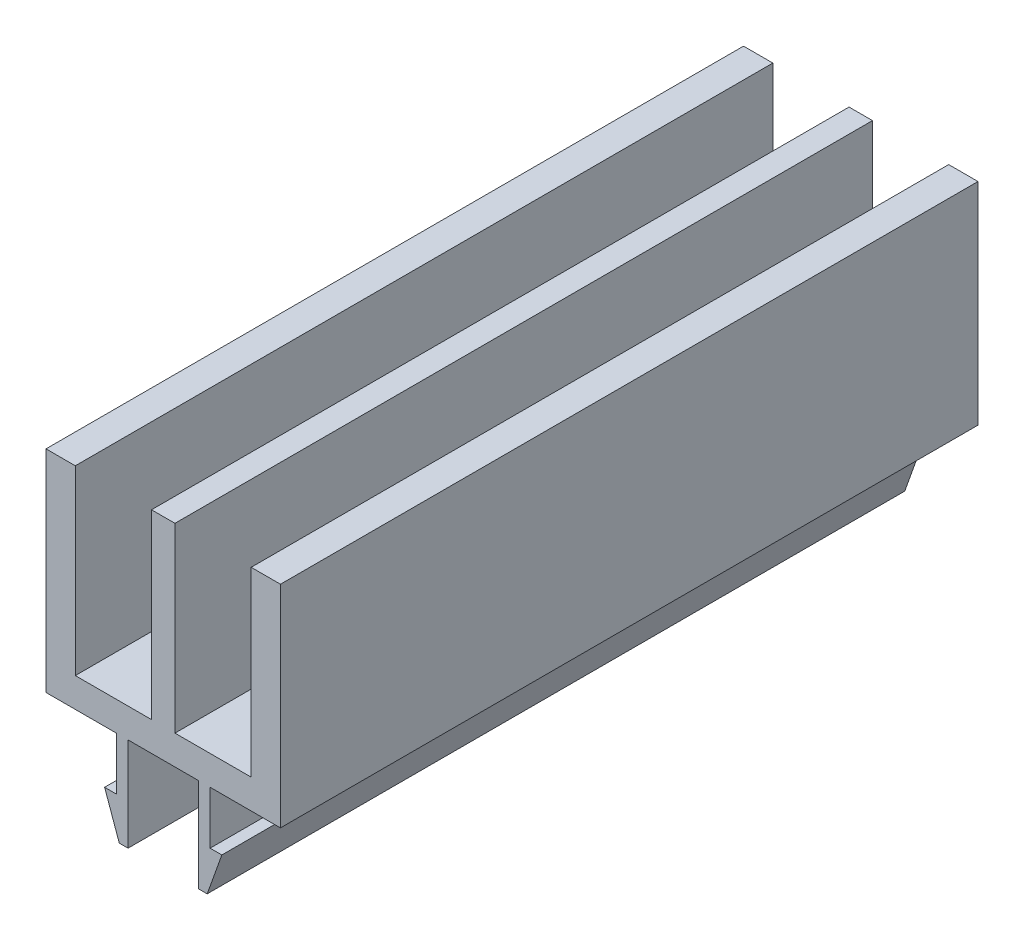
ISO-10303-21;
HEADER;
FILE_DESCRIPTION(('STEP AP214'),'2;1');
FILE_NAME('part.step','',(''),(''),'','','');
FILE_SCHEMA(('AUTOMOTIVE_DESIGN { 1 0 10303 214 1 1 1 1 }'));
ENDSEC;
DATA;
#1=APPLICATION_CONTEXT('core data for automotive mechanical design processes');
#2=APPLICATION_PROTOCOL_DEFINITION('international standard','automotive_design',2000,#1);
#3=PRODUCT_CONTEXT('',#1,'mechanical');
#4=PRODUCT('Part','Part','',(#3));
#5=PRODUCT_RELATED_PRODUCT_CATEGORY('part','',(#4));
#6=PRODUCT_DEFINITION_FORMATION('','',#4);
#7=PRODUCT_DEFINITION_CONTEXT('part definition',#1,'design');
#8=PRODUCT_DEFINITION('design','',#6,#7);
#9=PRODUCT_DEFINITION_SHAPE('','',#8);
#10=(LENGTH_UNIT() NAMED_UNIT(*) SI_UNIT(.MILLI.,.METRE.));
#11=(NAMED_UNIT(*) PLANE_ANGLE_UNIT() SI_UNIT($,.RADIAN.));
#12=(NAMED_UNIT(*) SI_UNIT($,.STERADIAN.) SOLID_ANGLE_UNIT());
#13=UNCERTAINTY_MEASURE_WITH_UNIT(LENGTH_MEASURE(1.E-05),#10,'distance_accuracy_value','');
#14=(GEOMETRIC_REPRESENTATION_CONTEXT(3) GLOBAL_UNCERTAINTY_ASSIGNED_CONTEXT((#13)) GLOBAL_UNIT_ASSIGNED_CONTEXT((#10,
#11,#12)) REPRESENTATION_CONTEXT('',''));
#15=CARTESIAN_POINT('',(0.,0.,0.));
#16=DIRECTION('',(0.,0.,1.));
#17=DIRECTION('',(1.,0.,0.));
#18=AXIS2_PLACEMENT_3D('',#15,#16,#17);
#19=CARTESIAN_POINT('',(-1.,17.9999999975,-9.49999999999999));
#20=DIRECTION('',(-1.,0.,0.));
#21=DIRECTION('',(0.,-1.,0.));
#22=AXIS2_PLACEMENT_3D('',#19,#20,#21);
#23=PLANE('',#22);
#24=DIRECTION('',(0.,-1.,0.));
#25=VECTOR('',#24,1.);
#26=CARTESIAN_POINT('',(-1.,17.9999999975,50.));
#27=LINE('',#26,#25);
#28=CARTESIAN_POINT('',(-1.,17.9999999975,50.));
#29=VERTEX_POINT('',#28);
#30=CARTESIAN_POINT('',(-1.,2.4999999995,50.));
#31=VERTEX_POINT('',#30);
#32=EDGE_CURVE('E226',#29,#31,#27,.T.);
#33=ORIENTED_EDGE('',*,*,#32,.F.);
#34=DIRECTION('',(0.,0.,1.));
#35=VECTOR('',#34,1.);
#36=CARTESIAN_POINT('',(-1.,17.9999999975,-9.49999999999999));
#37=LINE('',#36,#35);
#38=CARTESIAN_POINT('',(-1.,17.9999999975,-9.49999999999999));
#39=VERTEX_POINT('',#38);
#40=EDGE_CURVE('E11',#39,#29,#37,.T.);
#41=ORIENTED_EDGE('',*,*,#40,.F.);
#42=DIRECTION('',(0.,-1.,0.));
#43=VECTOR('',#42,1.);
#44=CARTESIAN_POINT('',(-1.,17.9999999975,-9.49999999999999));
#45=LINE('',#44,#43);
#46=CARTESIAN_POINT('',(-1.,2.4999999995,-9.49999999999999));
#47=VERTEX_POINT('',#46);
#48=EDGE_CURVE('E294',#39,#47,#45,.T.);
#49=ORIENTED_EDGE('',*,*,#48,.T.);
#50=DIRECTION('',(0.,0.,1.));
#51=VECTOR('',#50,1.);
#52=CARTESIAN_POINT('',(-1.,2.4999999995,-9.49999999999999));
#53=LINE('',#52,#51);
#54=EDGE_CURVE('E36',#47,#31,#53,.T.);
#55=ORIENTED_EDGE('',*,*,#54,.T.);
#56=EDGE_LOOP('',(#33,#41,#49,#55));
#57=FACE_BOUND('',#56,.T.);
#58=ADVANCED_FACE('F33',(#57),#23,.T.);
#59=CARTESIAN_POINT('',(0.999999999999998,17.9999999975,-9.49999999999999));
#60=DIRECTION('',(0.,1.,0.));
#61=DIRECTION('',(0.,0.,1.));
#62=AXIS2_PLACEMENT_3D('',#59,#60,#61);
#63=PLANE('',#62);
#64=DIRECTION('',(-1.,0.,0.));
#65=VECTOR('',#64,1.);
#66=CARTESIAN_POINT('',(0.999999999999998,17.9999999975,50.));
#67=LINE('',#66,#65);
#68=CARTESIAN_POINT('',(0.999999999999998,17.9999999975,50.));
#69=VERTEX_POINT('',#68);
#70=EDGE_CURVE('E292',#69,#29,#67,.T.);
#71=ORIENTED_EDGE('',*,*,#70,.F.);
#72=DIRECTION('',(0.,0.,1.));
#73=VECTOR('',#72,1.);
#74=CARTESIAN_POINT('',(0.999999999999998,17.9999999975,-9.49999999999999));
#75=LINE('',#74,#73);
#76=CARTESIAN_POINT('',(0.999999999999998,17.9999999975,-9.49999999999999));
#77=VERTEX_POINT('',#76);
#78=EDGE_CURVE('E42',#77,#69,#75,.T.);
#79=ORIENTED_EDGE('',*,*,#78,.F.);
#80=DIRECTION('',(-1.,0.,0.));
#81=VECTOR('',#80,1.);
#82=CARTESIAN_POINT('',(0.999999999999998,17.9999999975,-9.49999999999999));
#83=LINE('',#82,#81);
#84=EDGE_CURVE('E216',#77,#39,#83,.T.);
#85=ORIENTED_EDGE('',*,*,#84,.T.);
#86=ORIENTED_EDGE('',*,*,#40,.T.);
#87=EDGE_LOOP('',(#71,#79,#85,#86));
#88=FACE_BOUND('',#87,.T.);
#89=ADVANCED_FACE('F338',(#88),#63,.T.);
#90=CARTESIAN_POINT('',(0.999999999999998,2.4999999995,-9.49999999999999));
#91=DIRECTION('',(1.,0.,0.));
#92=DIRECTION('',(0.,0.,-1.));
#93=AXIS2_PLACEMENT_3D('',#90,#91,#92);
#94=PLANE('',#93);
#95=DIRECTION('',(0.,1.,0.));
#96=VECTOR('',#95,1.);
#97=CARTESIAN_POINT('',(0.999999999999998,2.4999999995,50.));
#98=LINE('',#97,#96);
#99=CARTESIAN_POINT('',(0.999999999999998,2.4999999995,50.));
#100=VERTEX_POINT('',#99);
#101=EDGE_CURVE('E203',#100,#69,#98,.T.);
#102=ORIENTED_EDGE('',*,*,#101,.F.);
#103=DIRECTION('',(0.,0.,1.));
#104=VECTOR('',#103,1.);
#105=CARTESIAN_POINT('',(0.999999999999998,2.4999999995,-9.49999999999999));
#106=LINE('',#105,#104);
#107=CARTESIAN_POINT('',(0.999999999999998,2.4999999995,-9.49999999999999));
#108=VERTEX_POINT('',#107);
#109=EDGE_CURVE('E198',#108,#100,#106,.T.);
#110=ORIENTED_EDGE('',*,*,#109,.F.);
#111=DIRECTION('',(0.,1.,0.));
#112=VECTOR('',#111,1.);
#113=CARTESIAN_POINT('',(0.999999999999998,2.4999999995,-9.49999999999999));
#114=LINE('',#113,#112);
#115=EDGE_CURVE('E201',#108,#77,#114,.T.);
#116=ORIENTED_EDGE('',*,*,#115,.T.);
#117=ORIENTED_EDGE('',*,*,#78,.T.);
#118=EDGE_LOOP('',(#102,#110,#116,#117));
#119=FACE_BOUND('',#118,.T.);
#120=ADVANCED_FACE('F200',(#119),#94,.T.);
#121=CARTESIAN_POINT('',(7.5,2.4999999995,-9.49999999999999));
#122=DIRECTION('',(0.,1.,0.));
#123=DIRECTION('',(-1.,0.,0.));
#124=AXIS2_PLACEMENT_3D('',#121,#122,#123);
#125=PLANE('',#124);
#126=DIRECTION('',(-1.,0.,0.));
#127=VECTOR('',#126,1.);
#128=CARTESIAN_POINT('',(7.5,2.4999999995,50.));
#129=LINE('',#128,#127);
#130=CARTESIAN_POINT('',(7.5,2.4999999995,50.));
#131=VERTEX_POINT('',#130);
#132=EDGE_CURVE('E289',#131,#100,#129,.T.);
#133=ORIENTED_EDGE('',*,*,#132,.F.);
#134=DIRECTION('',(0.,0.,1.));
#135=VECTOR('',#134,1.);
#136=CARTESIAN_POINT('',(7.5,2.4999999995,-9.49999999999999));
#137=LINE('',#136,#135);
#138=CARTESIAN_POINT('',(7.5,2.4999999995,-9.49999999999999));
#139=VERTEX_POINT('',#138);
#140=EDGE_CURVE('E208',#139,#131,#137,.T.);
#141=ORIENTED_EDGE('',*,*,#140,.F.);
#142=DIRECTION('',(-1.,0.,0.));
#143=VECTOR('',#142,1.);
#144=CARTESIAN_POINT('',(7.5,2.4999999995,-9.49999999999999));
#145=LINE('',#144,#143);
#146=EDGE_CURVE('E214',#139,#108,#145,.T.);
#147=ORIENTED_EDGE('',*,*,#146,.T.);
#148=ORIENTED_EDGE('',*,*,#109,.T.);
#149=EDGE_LOOP('',(#133,#141,#147,#148));
#150=FACE_BOUND('',#149,.T.);
#151=ADVANCED_FACE('F218',(#150),#125,.T.);
#152=CARTESIAN_POINT('',(7.5,17.9999999975,-9.49999999999999));
#153=DIRECTION('',(-1.,0.,0.));
#154=DIRECTION('',(0.,-1.,0.));
#155=AXIS2_PLACEMENT_3D('',#152,#153,#154);
#156=PLANE('',#155);
#157=DIRECTION('',(0.,-1.,0.));
#158=VECTOR('',#157,1.);
#159=CARTESIAN_POINT('',(7.5,17.9999999975,50.));
#160=LINE('',#159,#158);
#161=CARTESIAN_POINT('',(7.5,17.9999999975,50.));
#162=VERTEX_POINT('',#161);
#163=EDGE_CURVE('E286',#162,#131,#160,.T.);
#164=ORIENTED_EDGE('',*,*,#163,.F.);
#165=DIRECTION('',(0.,0.,1.));
#166=VECTOR('',#165,1.);
#167=CARTESIAN_POINT('',(7.5,17.9999999975,-9.49999999999999));
#168=LINE('',#167,#166);
#169=CARTESIAN_POINT('',(7.5,17.9999999975,-9.49999999999999));
#170=VERTEX_POINT('',#169);
#171=EDGE_CURVE('E298',#170,#162,#168,.T.);
#172=ORIENTED_EDGE('',*,*,#171,.F.);
#173=DIRECTION('',(0.,-1.,0.));
#174=VECTOR('',#173,1.);
#175=CARTESIAN_POINT('',(7.5,17.9999999975,-9.49999999999999));
#176=LINE('',#175,#174);
#177=EDGE_CURVE('E219',#170,#139,#176,.T.);
#178=ORIENTED_EDGE('',*,*,#177,.T.);
#179=ORIENTED_EDGE('',*,*,#140,.T.);
#180=EDGE_LOOP('',(#164,#172,#178,#179));
#181=FACE_BOUND('',#180,.T.);
#182=ADVANCED_FACE('F351',(#181),#156,.T.);
#183=CARTESIAN_POINT('',(10.,17.9999999975,-9.49999999999999));
#184=DIRECTION('',(0.,1.,0.));
#185=DIRECTION('',(0.,0.,1.));
#186=AXIS2_PLACEMENT_3D('',#183,#184,#185);
#187=PLANE('',#186);
#188=DIRECTION('',(-1.,0.,0.));
#189=VECTOR('',#188,1.);
#190=CARTESIAN_POINT('',(10.,17.9999999975,50.));
#191=LINE('',#190,#189);
#192=CARTESIAN_POINT('',(10.,17.9999999975,50.));
#193=VERTEX_POINT('',#192);
#194=EDGE_CURVE('E283',#193,#162,#191,.T.);
#195=ORIENTED_EDGE('',*,*,#194,.F.);
#196=DIRECTION('',(0.,0.,1.));
#197=VECTOR('',#196,1.);
#198=CARTESIAN_POINT('',(10.,17.9999999975,-9.49999999999999));
#199=LINE('',#198,#197);
#200=CARTESIAN_POINT('',(10.,17.9999999975,-9.49999999999999));
#201=VERTEX_POINT('',#200);
#202=EDGE_CURVE('E300',#201,#193,#199,.T.);
#203=ORIENTED_EDGE('',*,*,#202,.F.);
#204=DIRECTION('',(-1.,0.,0.));
#205=VECTOR('',#204,1.);
#206=CARTESIAN_POINT('',(10.,17.9999999975,-9.49999999999999));
#207=LINE('',#206,#205);
#208=EDGE_CURVE('E221',#201,#170,#207,.T.);
#209=ORIENTED_EDGE('',*,*,#208,.T.);
#210=ORIENTED_EDGE('',*,*,#171,.T.);
#211=EDGE_LOOP('',(#195,#203,#209,#210));
#212=FACE_BOUND('',#211,.T.);
#213=ADVANCED_FACE('F354',(#212),#187,.T.);
#214=CARTESIAN_POINT('',(10.,-4.99999828349541E-10,-9.49999999999999));
#215=DIRECTION('',(1.,0.,0.));
#216=DIRECTION('',(0.,0.,-1.));
#217=AXIS2_PLACEMENT_3D('',#214,#215,#216);
#218=PLANE('',#217);
#219=DIRECTION('',(0.,1.,0.));
#220=VECTOR('',#219,1.);
#221=CARTESIAN_POINT('',(10.,-4.99999828349541E-10,50.));
#222=LINE('',#221,#220);
#223=CARTESIAN_POINT('',(10.,-4.99999828349541E-10,50.));
#224=VERTEX_POINT('',#223);
#225=EDGE_CURVE('E280',#224,#193,#222,.T.);
#226=ORIENTED_EDGE('',*,*,#225,.F.);
#227=DIRECTION('',(0.,0.,1.));
#228=VECTOR('',#227,1.);
#229=CARTESIAN_POINT('',(10.,-4.99999828349541E-10,-9.49999999999999));
#230=LINE('',#229,#228);
#231=CARTESIAN_POINT('',(10.,-4.99999828349541E-10,-9.49999999999999));
#232=VERTEX_POINT('',#231);
#233=EDGE_CURVE('E302',#232,#224,#230,.T.);
#234=ORIENTED_EDGE('',*,*,#233,.F.);
#235=DIRECTION('',(0.,1.,0.));
#236=VECTOR('',#235,1.);
#237=CARTESIAN_POINT('',(10.,-4.99999828349541E-10,-9.49999999999999));
#238=LINE('',#237,#236);
#239=EDGE_CURVE('E644',#232,#201,#238,.T.);
#240=ORIENTED_EDGE('',*,*,#239,.T.);
#241=ORIENTED_EDGE('',*,*,#202,.T.);
#242=EDGE_LOOP('',(#226,#234,#240,#241));
#243=FACE_BOUND('',#242,.T.);
#244=ADVANCED_FACE('F358',(#243),#218,.T.);
#245=CARTESIAN_POINT('',(4.,-4.99999998002099E-10,-9.49999999999999));
#246=DIRECTION('',(0.,-1.,0.));
#247=DIRECTION('',(1.,0.,0.));
#248=AXIS2_PLACEMENT_3D('',#245,#246,#247);
#249=PLANE('',#248);
#250=DIRECTION('',(1.,0.,0.));
#251=VECTOR('',#250,1.);
#252=CARTESIAN_POINT('',(4.,-4.99999998002099E-10,50.));
#253=LINE('',#252,#251);
#254=CARTESIAN_POINT('',(4.,-4.99999998002099E-10,50.));
#255=VERTEX_POINT('',#254);
#256=EDGE_CURVE('E277',#255,#224,#253,.T.);
#257=ORIENTED_EDGE('',*,*,#256,.F.);
#258=DIRECTION('',(0.,0.,1.));
#259=VECTOR('',#258,1.);
#260=CARTESIAN_POINT('',(4.,-4.99999998002099E-10,-9.49999999999999));
#261=LINE('',#260,#259);
#262=CARTESIAN_POINT('',(4.,-4.99999998002099E-10,-9.49999999999999));
#263=VERTEX_POINT('',#262);
#264=EDGE_CURVE('E304',#263,#255,#261,.T.);
#265=ORIENTED_EDGE('',*,*,#264,.F.);
#266=DIRECTION('',(1.,0.,0.));
#267=VECTOR('',#266,1.);
#268=CARTESIAN_POINT('',(4.,-4.99999998002099E-10,-9.49999999999999));
#269=LINE('',#268,#267);
#270=EDGE_CURVE('E648',#263,#232,#269,.T.);
#271=ORIENTED_EDGE('',*,*,#270,.T.);
#272=ORIENTED_EDGE('',*,*,#233,.T.);
#273=EDGE_LOOP('',(#257,#265,#271,#272));
#274=FACE_BOUND('',#273,.T.);
#275=ADVANCED_FACE('F362',(#274),#249,.T.);
#276=CARTESIAN_POINT('',(4.,-4.5,-9.49999999999999));
#277=DIRECTION('',(1.,0.,0.));
#278=DIRECTION('',(0.,0.,-1.));
#279=AXIS2_PLACEMENT_3D('',#276,#277,#278);
#280=PLANE('',#279);
#281=DIRECTION('',(0.,1.,0.));
#282=VECTOR('',#281,1.);
#283=CARTESIAN_POINT('',(4.,-4.5,50.));
#284=LINE('',#283,#282);
#285=CARTESIAN_POINT('',(4.,-4.5,50.));
#286=VERTEX_POINT('',#285);
#287=EDGE_CURVE('E274',#286,#255,#284,.T.);
#288=ORIENTED_EDGE('',*,*,#287,.F.);
#289=DIRECTION('',(0.,0.,1.));
#290=VECTOR('',#289,1.);
#291=CARTESIAN_POINT('',(4.,-4.5,-9.49999999999999));
#292=LINE('',#291,#290);
#293=CARTESIAN_POINT('',(4.,-4.5,-9.49999999999999));
#294=VERTEX_POINT('',#293);
#295=EDGE_CURVE('E306',#294,#286,#292,.T.);
#296=ORIENTED_EDGE('',*,*,#295,.F.);
#297=DIRECTION('',(0.,1.,0.));
#298=VECTOR('',#297,1.);
#299=CARTESIAN_POINT('',(4.,-4.5,-9.49999999999999));
#300=LINE('',#299,#298);
#301=EDGE_CURVE('E637',#294,#263,#300,.T.);
#302=ORIENTED_EDGE('',*,*,#301,.T.);
#303=ORIENTED_EDGE('',*,*,#264,.T.);
#304=EDGE_LOOP('',(#288,#296,#302,#303));
#305=FACE_BOUND('',#304,.T.);
#306=ADVANCED_FACE('F366',(#305),#280,.T.);
#307=CARTESIAN_POINT('',(5.,-4.5,-9.49999999999999));
#308=DIRECTION('',(0.,1.,0.));
#309=DIRECTION('',(0.,0.,1.));
#310=AXIS2_PLACEMENT_3D('',#307,#308,#309);
#311=PLANE('',#310);
#312=DIRECTION('',(-1.,0.,0.));
#313=VECTOR('',#312,1.);
#314=CARTESIAN_POINT('',(5.,-4.5,50.));
#315=LINE('',#314,#313);
#316=CARTESIAN_POINT('',(5.,-4.5,50.));
#317=VERTEX_POINT('',#316);
#318=EDGE_CURVE('E271',#317,#286,#315,.T.);
#319=ORIENTED_EDGE('',*,*,#318,.F.);
#320=DIRECTION('',(0.,0.,1.));
#321=VECTOR('',#320,1.);
#322=CARTESIAN_POINT('',(5.,-4.5,-9.49999999999999));
#323=LINE('',#322,#321);
#324=CARTESIAN_POINT('',(5.,-4.5,-9.49999999999999));
#325=VERTEX_POINT('',#324);
#326=EDGE_CURVE('E308',#325,#317,#323,.T.);
#327=ORIENTED_EDGE('',*,*,#326,.F.);
#328=DIRECTION('',(-1.,0.,0.));
#329=VECTOR('',#328,1.);
#330=CARTESIAN_POINT('',(5.,-4.5,-9.49999999999999));
#331=LINE('',#330,#329);
#332=EDGE_CURVE('E633',#325,#294,#331,.T.);
#333=ORIENTED_EDGE('',*,*,#332,.T.);
#334=ORIENTED_EDGE('',*,*,#295,.T.);
#335=EDGE_LOOP('',(#319,#327,#333,#334));
#336=FACE_BOUND('',#335,.T.);
#337=ADVANCED_FACE('F370',(#336),#311,.T.);
#338=CARTESIAN_POINT('',(3.75,-8.,-9.49999999999999));
#339=DIRECTION('',(0.941741911594837,-0.336336396998156,0.));
#340=DIRECTION('',(0.336336396998156,0.941741911594838,0.));
#341=AXIS2_PLACEMENT_3D('',#338,#339,#340);
#342=PLANE('',#341);
#343=DIRECTION('',(0.336336396998157,0.941741911594837,0.));
#344=VECTOR('',#343,1.);
#345=CARTESIAN_POINT('',(3.75,-8.,50.));
#346=LINE('',#345,#344);
#347=CARTESIAN_POINT('',(3.75,-8.,50.));
#348=VERTEX_POINT('',#347);
#349=EDGE_CURVE('E268',#348,#317,#346,.T.);
#350=ORIENTED_EDGE('',*,*,#349,.F.);
#351=DIRECTION('',(0.,0.,1.));
#352=VECTOR('',#351,1.);
#353=CARTESIAN_POINT('',(3.75,-8.,-9.49999999999999));
#354=LINE('',#353,#352);
#355=CARTESIAN_POINT('',(3.75,-8.,-9.49999999999999));
#356=VERTEX_POINT('',#355);
#357=EDGE_CURVE('E310',#356,#348,#354,.T.);
#358=ORIENTED_EDGE('',*,*,#357,.F.);
#359=DIRECTION('',(0.336336396998157,0.941741911594837,0.));
#360=VECTOR('',#359,1.);
#361=CARTESIAN_POINT('',(3.75,-8.,-9.49999999999999));
#362=LINE('',#361,#360);
#363=EDGE_CURVE('E654',#356,#325,#362,.T.);
#364=ORIENTED_EDGE('',*,*,#363,.T.);
#365=ORIENTED_EDGE('',*,*,#326,.T.);
#366=EDGE_LOOP('',(#350,#358,#364,#365));
#367=FACE_BOUND('',#366,.T.);
#368=ADVANCED_FACE('F374',(#367),#342,.T.);
#369=CARTESIAN_POINT('',(3.,-8.,-9.49999999999999));
#370=DIRECTION('',(0.,-1.,0.));
#371=DIRECTION('',(0.,0.,-1.));
#372=AXIS2_PLACEMENT_3D('',#369,#370,#371);
#373=PLANE('',#372);
#374=DIRECTION('',(1.,0.,0.));
#375=VECTOR('',#374,1.);
#376=CARTESIAN_POINT('',(3.,-8.,50.));
#377=LINE('',#376,#375);
#378=CARTESIAN_POINT('',(3.,-8.,50.));
#379=VERTEX_POINT('',#378);
#380=EDGE_CURVE('E265',#379,#348,#377,.T.);
#381=ORIENTED_EDGE('',*,*,#380,.F.);
#382=DIRECTION('',(0.,0.,1.));
#383=VECTOR('',#382,1.);
#384=CARTESIAN_POINT('',(3.,-8.,-9.49999999999999));
#385=LINE('',#384,#383);
#386=CARTESIAN_POINT('',(3.,-8.,-9.49999999999999));
#387=VERTEX_POINT('',#386);
#388=EDGE_CURVE('E312',#387,#379,#385,.T.);
#389=ORIENTED_EDGE('',*,*,#388,.F.);
#390=DIRECTION('',(1.,0.,0.));
#391=VECTOR('',#390,1.);
#392=CARTESIAN_POINT('',(3.,-8.,-9.49999999999999));
#393=LINE('',#392,#391);
#394=EDGE_CURVE('E626',#387,#356,#393,.T.);
#395=ORIENTED_EDGE('',*,*,#394,.T.);
#396=ORIENTED_EDGE('',*,*,#357,.T.);
#397=EDGE_LOOP('',(#381,#389,#395,#396));
#398=FACE_BOUND('',#397,.T.);
#399=ADVANCED_FACE('F378',(#398),#373,.T.);
#400=CARTESIAN_POINT('',(3.,-4.9999985194348E-10,-9.49999999999999));
#401=DIRECTION('',(-1.,0.,0.));
#402=DIRECTION('',(0.,0.,1.));
#403=AXIS2_PLACEMENT_3D('',#400,#401,#402);
#404=PLANE('',#403);
#405=DIRECTION('',(0.,-1.,0.));
#406=VECTOR('',#405,1.);
#407=CARTESIAN_POINT('',(3.,-4.9999985194348E-10,50.));
#408=LINE('',#407,#406);
#409=CARTESIAN_POINT('',(3.,-4.9999985194348E-10,50.));
#410=VERTEX_POINT('',#409);
#411=EDGE_CURVE('E262',#410,#379,#408,.T.);
#412=ORIENTED_EDGE('',*,*,#411,.F.);
#413=DIRECTION('',(0.,0.,1.));
#414=VECTOR('',#413,1.);
#415=CARTESIAN_POINT('',(3.,-4.9999985194348E-10,-9.49999999999999));
#416=LINE('',#415,#414);
#417=CARTESIAN_POINT('',(3.,-4.9999985194348E-10,-9.49999999999999));
#418=VERTEX_POINT('',#417);
#419=EDGE_CURVE('E314',#418,#410,#416,.T.);
#420=ORIENTED_EDGE('',*,*,#419,.F.);
#421=DIRECTION('',(0.,-1.,0.));
#422=VECTOR('',#421,1.);
#423=CARTESIAN_POINT('',(3.,-4.9999985194348E-10,-9.49999999999999));
#424=LINE('',#423,#422);
#425=EDGE_CURVE('E622',#418,#387,#424,.T.);
#426=ORIENTED_EDGE('',*,*,#425,.T.);
#427=ORIENTED_EDGE('',*,*,#388,.T.);
#428=EDGE_LOOP('',(#412,#420,#426,#427));
#429=FACE_BOUND('',#428,.T.);
#430=ADVANCED_FACE('F382',(#429),#404,.T.);
#431=CARTESIAN_POINT('',(-3.,-4.99999455901012E-10,-9.49999999999999));
#432=DIRECTION('',(0.,-1.,0.));
#433=DIRECTION('',(1.,0.,0.));
#434=AXIS2_PLACEMENT_3D('',#431,#432,#433);
#435=PLANE('',#434);
#436=DIRECTION('',(1.,0.,0.));
#437=VECTOR('',#436,1.);
#438=CARTESIAN_POINT('',(-3.,-4.99999455901012E-10,50.));
#439=LINE('',#438,#437);
#440=CARTESIAN_POINT('',(-3.,-4.99999455901012E-10,50.));
#441=VERTEX_POINT('',#440);
#442=EDGE_CURVE('E259',#441,#410,#439,.T.);
#443=ORIENTED_EDGE('',*,*,#442,.F.);
#444=DIRECTION('',(0.,0.,1.));
#445=VECTOR('',#444,1.);
#446=CARTESIAN_POINT('',(-3.,-4.99999455901012E-10,-9.49999999999999));
#447=LINE('',#446,#445);
#448=CARTESIAN_POINT('',(-3.,-4.99999455901012E-10,-9.49999999999999));
#449=VERTEX_POINT('',#448);
#450=EDGE_CURVE('E316',#449,#441,#447,.T.);
#451=ORIENTED_EDGE('',*,*,#450,.F.);
#452=DIRECTION('',(1.,0.,0.));
#453=VECTOR('',#452,1.);
#454=CARTESIAN_POINT('',(-3.,-4.99999455901012E-10,-9.49999999999999));
#455=LINE('',#454,#453);
#456=EDGE_CURVE('E658',#449,#418,#455,.T.);
#457=ORIENTED_EDGE('',*,*,#456,.T.);
#458=ORIENTED_EDGE('',*,*,#419,.T.);
#459=EDGE_LOOP('',(#443,#451,#457,#458));
#460=FACE_BOUND('',#459,.T.);
#461=ADVANCED_FACE('F386',(#460),#435,.T.);
#462=CARTESIAN_POINT('',(-3.,-8.,-9.49999999999999));
#463=DIRECTION('',(1.,0.,0.));
#464=DIRECTION('',(0.,0.,-1.));
#465=AXIS2_PLACEMENT_3D('',#462,#463,#464);
#466=PLANE('',#465);
#467=DIRECTION('',(0.,1.,0.));
#468=VECTOR('',#467,1.);
#469=CARTESIAN_POINT('',(-3.,-8.,50.));
#470=LINE('',#469,#468);
#471=CARTESIAN_POINT('',(-3.,-8.,50.));
#472=VERTEX_POINT('',#471);
#473=EDGE_CURVE('E256',#472,#441,#470,.T.);
#474=ORIENTED_EDGE('',*,*,#473,.F.);
#475=DIRECTION('',(0.,0.,1.));
#476=VECTOR('',#475,1.);
#477=CARTESIAN_POINT('',(-3.,-8.,-9.49999999999999));
#478=LINE('',#477,#476);
#479=CARTESIAN_POINT('',(-3.,-8.,-9.49999999999999));
#480=VERTEX_POINT('',#479);
#481=EDGE_CURVE('E318',#480,#472,#478,.T.);
#482=ORIENTED_EDGE('',*,*,#481,.F.);
#483=DIRECTION('',(0.,1.,0.));
#484=VECTOR('',#483,1.);
#485=CARTESIAN_POINT('',(-3.,-8.,-9.49999999999999));
#486=LINE('',#485,#484);
#487=EDGE_CURVE('E615',#480,#449,#486,.T.);
#488=ORIENTED_EDGE('',*,*,#487,.T.);
#489=ORIENTED_EDGE('',*,*,#450,.T.);
#490=EDGE_LOOP('',(#474,#482,#488,#489));
#491=FACE_BOUND('',#490,.T.);
#492=ADVANCED_FACE('F390',(#491),#466,.T.);
#493=CARTESIAN_POINT('',(-3.75,-8.,-9.49999999999999));
#494=DIRECTION('',(0.,-1.,0.));
#495=DIRECTION('',(0.,0.,-1.));
#496=AXIS2_PLACEMENT_3D('',#493,#494,#495);
#497=PLANE('',#496);
#498=DIRECTION('',(1.,0.,0.));
#499=VECTOR('',#498,1.);
#500=CARTESIAN_POINT('',(-3.75,-8.,50.));
#501=LINE('',#500,#499);
#502=CARTESIAN_POINT('',(-3.75,-8.,50.));
#503=VERTEX_POINT('',#502);
#504=EDGE_CURVE('E253',#503,#472,#501,.T.);
#505=ORIENTED_EDGE('',*,*,#504,.F.);
#506=DIRECTION('',(0.,0.,1.));
#507=VECTOR('',#506,1.);
#508=CARTESIAN_POINT('',(-3.75,-8.,-9.49999999999999));
#509=LINE('',#508,#507);
#510=CARTESIAN_POINT('',(-3.75,-8.,-9.49999999999999));
#511=VERTEX_POINT('',#510);
#512=EDGE_CURVE('E320',#511,#503,#509,.T.);
#513=ORIENTED_EDGE('',*,*,#512,.F.);
#514=DIRECTION('',(1.,0.,0.));
#515=VECTOR('',#514,1.);
#516=CARTESIAN_POINT('',(-3.75,-8.,-9.49999999999999));
#517=LINE('',#516,#515);
#518=EDGE_CURVE('E611',#511,#480,#517,.T.);
#519=ORIENTED_EDGE('',*,*,#518,.T.);
#520=ORIENTED_EDGE('',*,*,#481,.T.);
#521=EDGE_LOOP('',(#505,#513,#519,#520));
#522=FACE_BOUND('',#521,.T.);
#523=ADVANCED_FACE('F394',(#522),#497,.T.);
#524=CARTESIAN_POINT('',(-5.,-4.5,-9.49999999999999));
#525=DIRECTION('',(-0.941741911594837,-0.336336396998156,0.));
#526=DIRECTION('',(0.336336396998156,-0.941741911594838,0.));
#527=AXIS2_PLACEMENT_3D('',#524,#525,#526);
#528=PLANE('',#527);
#529=DIRECTION('',(0.336336396998156,-0.941741911594837,0.));
#530=VECTOR('',#529,1.);
#531=CARTESIAN_POINT('',(-5.,-4.5,50.));
#532=LINE('',#531,#530);
#533=CARTESIAN_POINT('',(-5.,-4.5,50.));
#534=VERTEX_POINT('',#533);
#535=EDGE_CURVE('E250',#534,#503,#532,.T.);
#536=ORIENTED_EDGE('',*,*,#535,.F.);
#537=DIRECTION('',(0.,0.,1.));
#538=VECTOR('',#537,1.);
#539=CARTESIAN_POINT('',(-5.,-4.5,-9.49999999999999));
#540=LINE('',#539,#538);
#541=CARTESIAN_POINT('',(-5.,-4.5,-9.49999999999999));
#542=VERTEX_POINT('',#541);
#543=EDGE_CURVE('E322',#542,#534,#540,.T.);
#544=ORIENTED_EDGE('',*,*,#543,.F.);
#545=DIRECTION('',(0.336336396998156,-0.941741911594837,0.));
#546=VECTOR('',#545,1.);
#547=CARTESIAN_POINT('',(-5.,-4.5,-9.49999999999999));
#548=LINE('',#547,#546);
#549=EDGE_CURVE('E662',#542,#511,#548,.T.);
#550=ORIENTED_EDGE('',*,*,#549,.T.);
#551=ORIENTED_EDGE('',*,*,#512,.T.);
#552=EDGE_LOOP('',(#536,#544,#550,#551));
#553=FACE_BOUND('',#552,.T.);
#554=ADVANCED_FACE('F398',(#553),#528,.T.);
#555=CARTESIAN_POINT('',(-4.,-4.5,-9.49999999999999));
#556=DIRECTION('',(0.,1.,0.));
#557=DIRECTION('',(0.,0.,1.));
#558=AXIS2_PLACEMENT_3D('',#555,#556,#557);
#559=PLANE('',#558);
#560=DIRECTION('',(-1.,0.,0.));
#561=VECTOR('',#560,1.);
#562=CARTESIAN_POINT('',(-4.,-4.5,50.));
#563=LINE('',#562,#561);
#564=CARTESIAN_POINT('',(-4.,-4.5,50.));
#565=VERTEX_POINT('',#564);
#566=EDGE_CURVE('E247',#565,#534,#563,.T.);
#567=ORIENTED_EDGE('',*,*,#566,.F.);
#568=DIRECTION('',(0.,0.,1.));
#569=VECTOR('',#568,1.);
#570=CARTESIAN_POINT('',(-4.,-4.5,-9.49999999999999));
#571=LINE('',#570,#569);
#572=CARTESIAN_POINT('',(-4.,-4.5,-9.49999999999999));
#573=VERTEX_POINT('',#572);
#574=EDGE_CURVE('E324',#573,#565,#571,.T.);
#575=ORIENTED_EDGE('',*,*,#574,.F.);
#576=DIRECTION('',(-1.,0.,0.));
#577=VECTOR('',#576,1.);
#578=CARTESIAN_POINT('',(-4.,-4.5,-9.49999999999999));
#579=LINE('',#578,#577);
#580=EDGE_CURVE('E604',#573,#542,#579,.T.);
#581=ORIENTED_EDGE('',*,*,#580,.T.);
#582=ORIENTED_EDGE('',*,*,#543,.T.);
#583=EDGE_LOOP('',(#567,#575,#581,#582));
#584=FACE_BOUND('',#583,.T.);
#585=ADVANCED_FACE('F402',(#584),#559,.T.);
#586=CARTESIAN_POINT('',(-4.,-4.9999985194348E-10,-9.49999999999999));
#587=DIRECTION('',(-1.,0.,0.));
#588=DIRECTION('',(0.,0.,1.));
#589=AXIS2_PLACEMENT_3D('',#586,#587,#588);
#590=PLANE('',#589);
#591=DIRECTION('',(0.,-1.,0.));
#592=VECTOR('',#591,1.);
#593=CARTESIAN_POINT('',(-4.,-4.9999985194348E-10,50.));
#594=LINE('',#593,#592);
#595=CARTESIAN_POINT('',(-4.,-4.9999985194348E-10,50.));
#596=VERTEX_POINT('',#595);
#597=EDGE_CURVE('E244',#596,#565,#594,.T.);
#598=ORIENTED_EDGE('',*,*,#597,.F.);
#599=DIRECTION('',(0.,0.,1.));
#600=VECTOR('',#599,1.);
#601=CARTESIAN_POINT('',(-4.,-4.9999985194348E-10,-9.49999999999999));
#602=LINE('',#601,#600);
#603=CARTESIAN_POINT('',(-4.,-4.9999985194348E-10,-9.49999999999999));
#604=VERTEX_POINT('',#603);
#605=EDGE_CURVE('E326',#604,#596,#602,.T.);
#606=ORIENTED_EDGE('',*,*,#605,.F.);
#607=DIRECTION('',(0.,-1.,0.));
#608=VECTOR('',#607,1.);
#609=CARTESIAN_POINT('',(-4.,-4.9999985194348E-10,-9.49999999999999));
#610=LINE('',#609,#608);
#611=EDGE_CURVE('E600',#604,#573,#610,.T.);
#612=ORIENTED_EDGE('',*,*,#611,.T.);
#613=ORIENTED_EDGE('',*,*,#574,.T.);
#614=EDGE_LOOP('',(#598,#606,#612,#613));
#615=FACE_BOUND('',#614,.T.);
#616=ADVANCED_FACE('F406',(#615),#590,.T.);
#617=CARTESIAN_POINT('',(-10.,-4.99999719929324E-10,-9.49999999999999));
#618=DIRECTION('',(0.,-1.,0.));
#619=DIRECTION('',(1.,0.,0.));
#620=AXIS2_PLACEMENT_3D('',#617,#618,#619);
#621=PLANE('',#620);
#622=DIRECTION('',(1.,0.,0.));
#623=VECTOR('',#622,1.);
#624=CARTESIAN_POINT('',(-10.,-4.99999719929324E-10,50.));
#625=LINE('',#624,#623);
#626=CARTESIAN_POINT('',(-10.,-4.99999719929324E-10,50.));
#627=VERTEX_POINT('',#626);
#628=EDGE_CURVE('E241',#627,#596,#625,.T.);
#629=ORIENTED_EDGE('',*,*,#628,.F.);
#630=DIRECTION('',(0.,0.,1.));
#631=VECTOR('',#630,1.);
#632=CARTESIAN_POINT('',(-10.,-4.99999719929324E-10,-9.49999999999999));
#633=LINE('',#632,#631);
#634=CARTESIAN_POINT('',(-10.,-4.99999719929324E-10,-9.49999999999999));
#635=VERTEX_POINT('',#634);
#636=EDGE_CURVE('E328',#635,#627,#633,.T.);
#637=ORIENTED_EDGE('',*,*,#636,.F.);
#638=DIRECTION('',(1.,0.,0.));
#639=VECTOR('',#638,1.);
#640=CARTESIAN_POINT('',(-10.,-4.99999719929324E-10,-9.49999999999999));
#641=LINE('',#640,#639);
#642=EDGE_CURVE('E666',#635,#604,#641,.T.);
#643=ORIENTED_EDGE('',*,*,#642,.T.);
#644=ORIENTED_EDGE('',*,*,#605,.T.);
#645=EDGE_LOOP('',(#629,#637,#643,#644));
#646=FACE_BOUND('',#645,.T.);
#647=ADVANCED_FACE('F410',(#646),#621,.T.);
#648=CARTESIAN_POINT('',(-10.,17.9999999975,-9.49999999999999));
#649=DIRECTION('',(-1.,0.,0.));
#650=DIRECTION('',(0.,-1.,0.));
#651=AXIS2_PLACEMENT_3D('',#648,#649,#650);
#652=PLANE('',#651);
#653=DIRECTION('',(0.,-1.,0.));
#654=VECTOR('',#653,1.);
#655=CARTESIAN_POINT('',(-10.,17.9999999975,50.));
#656=LINE('',#655,#654);
#657=CARTESIAN_POINT('',(-10.,17.9999999975,50.));
#658=VERTEX_POINT('',#657);
#659=EDGE_CURVE('E238',#658,#627,#656,.T.);
#660=ORIENTED_EDGE('',*,*,#659,.F.);
#661=DIRECTION('',(0.,0.,1.));
#662=VECTOR('',#661,1.);
#663=CARTESIAN_POINT('',(-10.,17.9999999975,-9.49999999999999));
#664=LINE('',#663,#662);
#665=CARTESIAN_POINT('',(-10.,17.9999999975,-9.49999999999999));
#666=VERTEX_POINT('',#665);
#667=EDGE_CURVE('E330',#666,#658,#664,.T.);
#668=ORIENTED_EDGE('',*,*,#667,.F.);
#669=DIRECTION('',(0.,-1.,0.));
#670=VECTOR('',#669,1.);
#671=CARTESIAN_POINT('',(-10.,17.9999999975,-9.49999999999999));
#672=LINE('',#671,#670);
#673=EDGE_CURVE('E593',#666,#635,#672,.T.);
#674=ORIENTED_EDGE('',*,*,#673,.T.);
#675=ORIENTED_EDGE('',*,*,#636,.T.);
#676=EDGE_LOOP('',(#660,#668,#674,#675));
#677=FACE_BOUND('',#676,.T.);
#678=ADVANCED_FACE('F414',(#677),#652,.T.);
#679=CARTESIAN_POINT('',(-7.5,17.9999999975,-9.49999999999999));
#680=DIRECTION('',(0.,1.,0.));
#681=DIRECTION('',(0.,0.,1.));
#682=AXIS2_PLACEMENT_3D('',#679,#680,#681);
#683=PLANE('',#682);
#684=DIRECTION('',(-1.,0.,0.));
#685=VECTOR('',#684,1.);
#686=CARTESIAN_POINT('',(-7.5,17.9999999975,50.));
#687=LINE('',#686,#685);
#688=CARTESIAN_POINT('',(-7.5,17.9999999975,50.));
#689=VERTEX_POINT('',#688);
#690=EDGE_CURVE('E235',#689,#658,#687,.T.);
#691=ORIENTED_EDGE('',*,*,#690,.F.);
#692=DIRECTION('',(0.,0.,1.));
#693=VECTOR('',#692,1.);
#694=CARTESIAN_POINT('',(-7.5,17.9999999975,-9.49999999999999));
#695=LINE('',#694,#693);
#696=CARTESIAN_POINT('',(-7.5,17.9999999975,-9.49999999999999));
#697=VERTEX_POINT('',#696);
#698=EDGE_CURVE('E332',#697,#689,#695,.T.);
#699=ORIENTED_EDGE('',*,*,#698,.F.);
#700=DIRECTION('',(-1.,0.,0.));
#701=VECTOR('',#700,1.);
#702=CARTESIAN_POINT('',(-7.5,17.9999999975,-9.49999999999999));
#703=LINE('',#702,#701);
#704=EDGE_CURVE('E589',#697,#666,#703,.T.);
#705=ORIENTED_EDGE('',*,*,#704,.T.);
#706=ORIENTED_EDGE('',*,*,#667,.T.);
#707=EDGE_LOOP('',(#691,#699,#705,#706));
#708=FACE_BOUND('',#707,.T.);
#709=ADVANCED_FACE('F418',(#708),#683,.T.);
#710=CARTESIAN_POINT('',(-7.5,2.4999999995,-9.49999999999999));
#711=DIRECTION('',(1.,0.,0.));
#712=DIRECTION('',(0.,0.,-1.));
#713=AXIS2_PLACEMENT_3D('',#710,#711,#712);
#714=PLANE('',#713);
#715=DIRECTION('',(0.,1.,0.));
#716=VECTOR('',#715,1.);
#717=CARTESIAN_POINT('',(-7.5,2.4999999995,50.));
#718=LINE('',#717,#716);
#719=CARTESIAN_POINT('',(-7.5,2.4999999995,50.));
#720=VERTEX_POINT('',#719);
#721=EDGE_CURVE('E232',#720,#689,#718,.T.);
#722=ORIENTED_EDGE('',*,*,#721,.F.);
#723=DIRECTION('',(0.,0.,1.));
#724=VECTOR('',#723,1.);
#725=CARTESIAN_POINT('',(-7.5,2.4999999995,-9.49999999999999));
#726=LINE('',#725,#724);
#727=CARTESIAN_POINT('',(-7.5,2.4999999995,-9.49999999999999));
#728=VERTEX_POINT('',#727);
#729=EDGE_CURVE('E333',#728,#720,#726,.T.);
#730=ORIENTED_EDGE('',*,*,#729,.F.);
#731=DIRECTION('',(0.,1.,0.));
#732=VECTOR('',#731,1.);
#733=CARTESIAN_POINT('',(-7.5,2.4999999995,-9.49999999999999));
#734=LINE('',#733,#732);
#735=EDGE_CURVE('E670',#728,#697,#734,.T.);
#736=ORIENTED_EDGE('',*,*,#735,.T.);
#737=ORIENTED_EDGE('',*,*,#698,.T.);
#738=EDGE_LOOP('',(#722,#730,#736,#737));
#739=FACE_BOUND('',#738,.T.);
#740=ADVANCED_FACE('F422',(#739),#714,.T.);
#741=CARTESIAN_POINT('',(-1.,2.4999999995,-9.49999999999999));
#742=DIRECTION('',(0.,1.,0.));
#743=DIRECTION('',(-1.,0.,0.));
#744=AXIS2_PLACEMENT_3D('',#741,#742,#743);
#745=PLANE('',#744);
#746=DIRECTION('',(-1.,0.,0.));
#747=VECTOR('',#746,1.);
#748=CARTESIAN_POINT('',(-1.,2.4999999995,50.));
#749=LINE('',#748,#747);
#750=EDGE_CURVE('E229',#31,#720,#749,.T.);
#751=ORIENTED_EDGE('',*,*,#750,.F.);
#752=ORIENTED_EDGE('',*,*,#54,.F.);
#753=DIRECTION('',(-1.,0.,0.));
#754=VECTOR('',#753,1.);
#755=CARTESIAN_POINT('',(-1.,2.4999999995,-9.49999999999999));
#756=LINE('',#755,#754);
#757=EDGE_CURVE('E672',#47,#728,#756,.T.);
#758=ORIENTED_EDGE('',*,*,#757,.T.);
#759=ORIENTED_EDGE('',*,*,#729,.T.);
#760=EDGE_LOOP('',(#751,#752,#758,#759));
#761=FACE_BOUND('',#760,.T.);
#762=ADVANCED_FACE('F335',(#761),#745,.T.);
#763=CARTESIAN_POINT('',(0.,0.,-9.49999999999999));
#764=DIRECTION('',(0.,0.,-1.));
#765=DIRECTION('',(-1.,0.,0.));
#766=AXIS2_PLACEMENT_3D('',#763,#764,#765);
#767=PLANE('',#766);
#768=ORIENTED_EDGE('',*,*,#48,.F.);
#769=ORIENTED_EDGE('',*,*,#84,.F.);
#770=ORIENTED_EDGE('',*,*,#115,.F.);
#771=ORIENTED_EDGE('',*,*,#146,.F.);
#772=ORIENTED_EDGE('',*,*,#177,.F.);
#773=ORIENTED_EDGE('',*,*,#208,.F.);
#774=ORIENTED_EDGE('',*,*,#239,.F.);
#775=ORIENTED_EDGE('',*,*,#270,.F.);
#776=ORIENTED_EDGE('',*,*,#301,.F.);
#777=ORIENTED_EDGE('',*,*,#332,.F.);
#778=ORIENTED_EDGE('',*,*,#363,.F.);
#779=ORIENTED_EDGE('',*,*,#394,.F.);
#780=ORIENTED_EDGE('',*,*,#425,.F.);
#781=ORIENTED_EDGE('',*,*,#456,.F.);
#782=ORIENTED_EDGE('',*,*,#487,.F.);
#783=ORIENTED_EDGE('',*,*,#518,.F.);
#784=ORIENTED_EDGE('',*,*,#549,.F.);
#785=ORIENTED_EDGE('',*,*,#580,.F.);
#786=ORIENTED_EDGE('',*,*,#611,.F.);
#787=ORIENTED_EDGE('',*,*,#642,.F.);
#788=ORIENTED_EDGE('',*,*,#673,.F.);
#789=ORIENTED_EDGE('',*,*,#704,.F.);
#790=ORIENTED_EDGE('',*,*,#735,.F.);
#791=ORIENTED_EDGE('',*,*,#757,.F.);
#792=EDGE_LOOP('',(#768,#769,#770,#771,#772,#773,#774,#775,#776,#777,#778,#779,#780,#781,#782,
#783,#784,#785,#786,#787,#788,#789,#790,#791));
#793=FACE_BOUND('',#792,.T.);
#794=ADVANCED_FACE('F212',(#793),#767,.T.);
#795=CARTESIAN_POINT('',(0.,0.,50.));
#796=DIRECTION('',(0.,0.,-1.));
#797=DIRECTION('',(-1.,0.,0.));
#798=AXIS2_PLACEMENT_3D('',#795,#796,#797);
#799=PLANE('',#798);
#800=ORIENTED_EDGE('',*,*,#32,.T.);
#801=ORIENTED_EDGE('',*,*,#750,.T.);
#802=ORIENTED_EDGE('',*,*,#721,.T.);
#803=ORIENTED_EDGE('',*,*,#690,.T.);
#804=ORIENTED_EDGE('',*,*,#659,.T.);
#805=ORIENTED_EDGE('',*,*,#628,.T.);
#806=ORIENTED_EDGE('',*,*,#597,.T.);
#807=ORIENTED_EDGE('',*,*,#566,.T.);
#808=ORIENTED_EDGE('',*,*,#535,.T.);
#809=ORIENTED_EDGE('',*,*,#504,.T.);
#810=ORIENTED_EDGE('',*,*,#473,.T.);
#811=ORIENTED_EDGE('',*,*,#442,.T.);
#812=ORIENTED_EDGE('',*,*,#411,.T.);
#813=ORIENTED_EDGE('',*,*,#380,.T.);
#814=ORIENTED_EDGE('',*,*,#349,.T.);
#815=ORIENTED_EDGE('',*,*,#318,.T.);
#816=ORIENTED_EDGE('',*,*,#287,.T.);
#817=ORIENTED_EDGE('',*,*,#256,.T.);
#818=ORIENTED_EDGE('',*,*,#225,.T.);
#819=ORIENTED_EDGE('',*,*,#194,.T.);
#820=ORIENTED_EDGE('',*,*,#163,.T.);
#821=ORIENTED_EDGE('',*,*,#132,.T.);
#822=ORIENTED_EDGE('',*,*,#101,.T.);
#823=ORIENTED_EDGE('',*,*,#70,.T.);
#824=EDGE_LOOP('',(#800,#801,#802,#803,#804,#805,#806,#807,#808,#809,#810,#811,#812,#813,#814,
#815,#816,#817,#818,#819,#820,#821,#822,#823));
#825=FACE_BOUND('',#824,.T.);
#826=ADVANCED_FACE('F337',(#825),#799,.F.);
#827=CLOSED_SHELL('',(#58,#89,#120,#151,#182,#213,#244,#275,#306,#337,#368,#399,#430,#461,#492,
#523,#554,#585,#616,#647,#678,#709,#740,#762,#794,#826));
#828=MANIFOLD_SOLID_BREP('B2',#827);
#829=ADVANCED_BREP_SHAPE_REPRESENTATION('',(#18,#828),#14);
#830=SHAPE_DEFINITION_REPRESENTATION(#9,#829);
ENDSEC;
END-ISO-10303-21;
